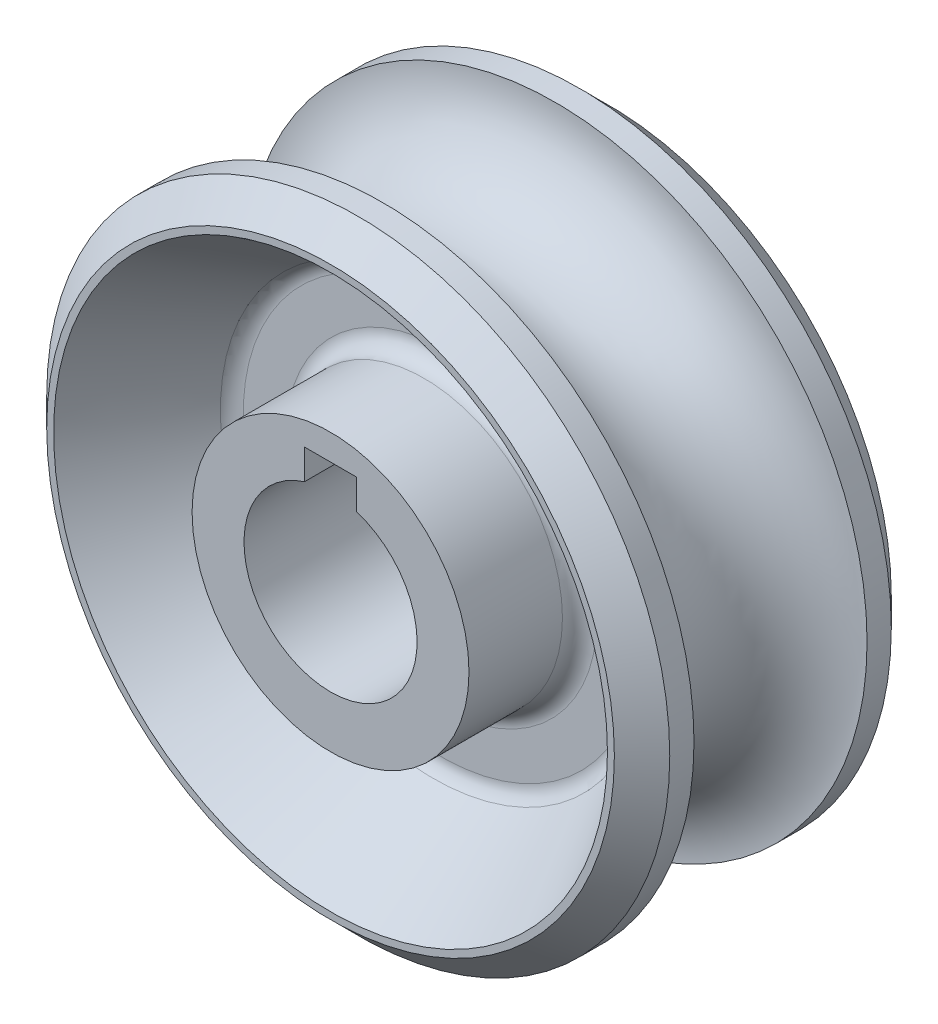
ISO-10303-21;
HEADER;
FILE_DESCRIPTION(('STEP AP214'),'2;1');
FILE_NAME('part.step','',(''),(''),'','','');
FILE_SCHEMA(('AUTOMOTIVE_DESIGN { 1 0 10303 214 1 1 1 1 }'));
ENDSEC;
DATA;
#1=APPLICATION_CONTEXT('core data for automotive mechanical design processes');
#2=APPLICATION_PROTOCOL_DEFINITION('international standard','automotive_design',2000,#1);
#3=PRODUCT_CONTEXT('',#1,'mechanical');
#4=PRODUCT('Part','Part','',(#3));
#5=PRODUCT_RELATED_PRODUCT_CATEGORY('part','',(#4));
#6=PRODUCT_DEFINITION_FORMATION('','',#4);
#7=PRODUCT_DEFINITION_CONTEXT('part definition',#1,'design');
#8=PRODUCT_DEFINITION('design','',#6,#7);
#9=PRODUCT_DEFINITION_SHAPE('','',#8);
#10=(LENGTH_UNIT() NAMED_UNIT(*) SI_UNIT(.MILLI.,.METRE.));
#11=(NAMED_UNIT(*) PLANE_ANGLE_UNIT() SI_UNIT($,.RADIAN.));
#12=(NAMED_UNIT(*) SI_UNIT($,.STERADIAN.) SOLID_ANGLE_UNIT());
#13=UNCERTAINTY_MEASURE_WITH_UNIT(LENGTH_MEASURE(1.E-05),#10,'distance_accuracy_value','');
#14=(GEOMETRIC_REPRESENTATION_CONTEXT(3) GLOBAL_UNCERTAINTY_ASSIGNED_CONTEXT((#13)) GLOBAL_UNIT_ASSIGNED_CONTEXT((#10,
#11,#12)) REPRESENTATION_CONTEXT('',''));
#15=CARTESIAN_POINT('',(0.,0.,0.));
#16=DIRECTION('',(0.,0.,1.));
#17=DIRECTION('',(1.,0.,0.));
#18=AXIS2_PLACEMENT_3D('',#15,#16,#17);
#19=CARTESIAN_POINT('',(0.,0.,12.7));
#20=DIRECTION('',(0.,0.,1.));
#21=DIRECTION('',(1.,0.,0.));
#22=AXIS2_PLACEMENT_3D('',#19,#20,#21);
#23=PLANE('',#22);
#24=CARTESIAN_POINT('',(0.,0.,12.7));
#25=DIRECTION('',(0.,0.,1.));
#26=DIRECTION('',(1.,0.,0.));
#27=AXIS2_PLACEMENT_3D('',#24,#25,#26);
#28=CIRCLE('',#27,26.035);
#29=CARTESIAN_POINT('',(26.035,0.,12.7));
#30=VERTEX_POINT('',#29);
#31=EDGE_CURVE('E136',#30,#30,#28,.T.);
#32=ORIENTED_EDGE('',*,*,#31,.T.);
#33=EDGE_LOOP('',(#32));
#34=FACE_BOUND('',#33,.T.);
#35=CARTESIAN_POINT('',(0.,0.,12.7));
#36=DIRECTION('',(0.,0.,1.));
#37=DIRECTION('',(1.,0.,0.));
#38=AXIS2_PLACEMENT_3D('',#35,#36,#37);
#39=CIRCLE('',#38,25.4);
#40=CARTESIAN_POINT('',(25.4,0.,12.7));
#41=VERTEX_POINT('',#40);
#42=EDGE_CURVE('E112',#41,#41,#39,.T.);
#43=ORIENTED_EDGE('',*,*,#42,.F.);
#44=EDGE_LOOP('',(#43));
#45=FACE_BOUND('',#44,.T.);
#46=ADVANCED_FACE('F37',(#34,#45),#23,.T.);
#47=CARTESIAN_POINT('',(0.,0.,12.7));
#48=DIRECTION('',(0.,0.,-1.));
#49=DIRECTION('',(-1.,0.,0.));
#50=AXIS2_PLACEMENT_3D('',#47,#48,#49);
#51=CYLINDRICAL_SURFACE('',#50,28.575);
#52=CARTESIAN_POINT('',(0.,0.,10.16));
#53=DIRECTION('',(0.,0.,1.));
#54=DIRECTION('',(1.,0.,0.));
#55=AXIS2_PLACEMENT_3D('',#52,#53,#54);
#56=CIRCLE('',#55,28.575);
#57=CARTESIAN_POINT('',(28.575,0.,10.16));
#58=VERTEX_POINT('',#57);
#59=EDGE_CURVE('E139',#58,#58,#56,.F.);
#60=ORIENTED_EDGE('',*,*,#59,.T.);
#61=EDGE_LOOP('',(#60));
#62=FACE_BOUND('',#61,.T.);
#63=CARTESIAN_POINT('',(0.,0.,7.9375));
#64=DIRECTION('',(0.,0.,-1.));
#65=DIRECTION('',(-1.,0.,0.));
#66=AXIS2_PLACEMENT_3D('',#63,#64,#65);
#67=CIRCLE('',#66,28.575);
#68=CARTESIAN_POINT('',(-28.575,0.,7.9375));
#69=VERTEX_POINT('',#68);
#70=EDGE_CURVE('E126',#69,#69,#67,.T.);
#71=ORIENTED_EDGE('',*,*,#70,.F.);
#72=EDGE_LOOP('',(#71));
#73=FACE_BOUND('',#72,.T.);
#74=ADVANCED_FACE('F191',(#62,#73),#51,.T.);
#75=CARTESIAN_POINT('',(0.,0.,-10.16));
#76=DIRECTION('',(0.,0.,1.));
#77=DIRECTION('',(1.,0.,0.));
#78=AXIS2_PLACEMENT_3D('',#75,#76,#77);
#79=CIRCLE('',#78,28.575);
#80=CARTESIAN_POINT('',(28.575,0.,-10.16));
#81=VERTEX_POINT('',#80);
#82=EDGE_CURVE('E122',#81,#81,#79,.T.);
#83=ORIENTED_EDGE('',*,*,#82,.T.);
#84=EDGE_LOOP('',(#83));
#85=FACE_BOUND('',#84,.T.);
#86=CARTESIAN_POINT('',(0.,0.,-7.9375));
#87=DIRECTION('',(0.,0.,1.));
#88=DIRECTION('',(1.,0.,0.));
#89=AXIS2_PLACEMENT_3D('',#86,#87,#88);
#90=CIRCLE('',#89,28.575);
#91=CARTESIAN_POINT('',(28.575,0.,-7.9375));
#92=VERTEX_POINT('',#91);
#93=EDGE_CURVE('E115',#92,#92,#90,.T.);
#94=ORIENTED_EDGE('',*,*,#93,.F.);
#95=EDGE_LOOP('',(#94));
#96=FACE_BOUND('',#95,.T.);
#97=ADVANCED_FACE('F197',(#85,#96),#51,.T.);
#98=CARTESIAN_POINT('',(0.,0.,-12.7));
#99=DIRECTION('',(0.,0.,1.));
#100=DIRECTION('',(1.,0.,0.));
#101=AXIS2_PLACEMENT_3D('',#98,#99,#100);
#102=PLANE('',#101);
#103=CARTESIAN_POINT('',(0.,0.,-12.7));
#104=DIRECTION('',(0.,0.,1.));
#105=DIRECTION('',(1.,0.,0.));
#106=AXIS2_PLACEMENT_3D('',#103,#104,#105);
#107=CIRCLE('',#106,26.035);
#108=CARTESIAN_POINT('',(26.035,0.,-12.7));
#109=VERTEX_POINT('',#108);
#110=EDGE_CURVE('E133',#109,#109,#107,.F.);
#111=ORIENTED_EDGE('',*,*,#110,.T.);
#112=EDGE_LOOP('',(#111));
#113=FACE_BOUND('',#112,.T.);
#114=CARTESIAN_POINT('',(0.,0.,-12.7));
#115=DIRECTION('',(0.,0.,1.));
#116=DIRECTION('',(1.,0.,0.));
#117=AXIS2_PLACEMENT_3D('',#114,#115,#116);
#118=CIRCLE('',#117,25.4);
#119=CARTESIAN_POINT('',(25.4,0.,-12.7));
#120=VERTEX_POINT('',#119);
#121=EDGE_CURVE('E108',#120,#120,#118,.T.);
#122=ORIENTED_EDGE('',*,*,#121,.T.);
#123=EDGE_LOOP('',(#122));
#124=FACE_BOUND('',#123,.T.);
#125=ADVANCED_FACE('F230',(#113,#124),#102,.F.);
#126=CARTESIAN_POINT('',(0.,0.,0.));
#127=DIRECTION('',(0.,0.,1.));
#128=DIRECTION('',(1.,0.,0.));
#129=AXIS2_PLACEMENT_3D('',#126,#127,#128);
#130=TOROIDAL_SURFACE('',#129,28.575,7.9375);
#131=ORIENTED_EDGE('',*,*,#93,.T.);
#132=EDGE_LOOP('',(#131));
#133=FACE_BOUND('',#132,.T.);
#134=ORIENTED_EDGE('',*,*,#70,.T.);
#135=EDGE_LOOP('',(#134));
#136=FACE_BOUND('',#135,.T.);
#137=ADVANCED_FACE('F225',(#133,#136),#130,.F.);
#138=CARTESIAN_POINT('',(0.,0.,0.));
#139=DIRECTION('',(0.,0.,1.));
#140=DIRECTION('',(1.,0.,0.));
#141=AXIS2_PLACEMENT_3D('',#138,#139,#140);
#142=CYLINDRICAL_SURFACE('',#141,12.7);
#143=CARTESIAN_POINT('',(0.,0.,-4.1275));
#144=DIRECTION('',(0.,0.,-1.));
#145=DIRECTION('',(-1.,0.,0.));
#146=AXIS2_PLACEMENT_3D('',#143,#144,#145);
#147=CIRCLE('',#146,12.7);
#148=CARTESIAN_POINT('',(-12.7,0.,-4.1275));
#149=VERTEX_POINT('',#148);
#150=EDGE_CURVE('E151',#149,#149,#147,.T.);
#151=ORIENTED_EDGE('',*,*,#150,.T.);
#152=EDGE_LOOP('',(#151));
#153=FACE_BOUND('',#152,.T.);
#154=CARTESIAN_POINT('',(0.,0.,-12.7));
#155=DIRECTION('',(0.,0.,1.));
#156=DIRECTION('',(1.,0.,0.));
#157=AXIS2_PLACEMENT_3D('',#154,#155,#156);
#158=CIRCLE('',#157,12.7);
#159=CARTESIAN_POINT('',(12.7,0.,-12.7));
#160=VERTEX_POINT('',#159);
#161=EDGE_CURVE('E111',#160,#160,#158,.T.);
#162=ORIENTED_EDGE('',*,*,#161,.T.);
#163=EDGE_LOOP('',(#162));
#164=FACE_BOUND('',#163,.T.);
#165=ADVANCED_FACE('F218',(#153,#164),#142,.T.);
#166=CARTESIAN_POINT('',(0.,12.7,-2.54));
#167=DIRECTION('',(0.,0.,-1.));
#168=DIRECTION('',(-1.,0.,0.));
#169=AXIS2_PLACEMENT_3D('',#166,#167,#168);
#170=PLANE('',#169);
#171=CARTESIAN_POINT('',(0.,0.,-2.54));
#172=DIRECTION('',(0.,0.,-1.));
#173=DIRECTION('',(-1.,0.,0.));
#174=AXIS2_PLACEMENT_3D('',#171,#172,#173);
#175=CIRCLE('',#174,18.1701318691075);
#176=CARTESIAN_POINT('',(-18.1701318691075,0.,-2.54));
#177=VERTEX_POINT('',#176);
#178=EDGE_CURVE('E148',#177,#177,#175,.T.);
#179=ORIENTED_EDGE('',*,*,#178,.T.);
#180=EDGE_LOOP('',(#179));
#181=FACE_BOUND('',#180,.T.);
#182=CARTESIAN_POINT('',(0.,0.,-2.54));
#183=DIRECTION('',(0.,0.,-1.));
#184=DIRECTION('',(-1.,0.,0.));
#185=AXIS2_PLACEMENT_3D('',#182,#183,#184);
#186=CIRCLE('',#185,14.2875);
#187=CARTESIAN_POINT('',(-14.2875,0.,-2.54));
#188=VERTEX_POINT('',#187);
#189=EDGE_CURVE('E145',#188,#188,#186,.F.);
#190=ORIENTED_EDGE('',*,*,#189,.T.);
#191=EDGE_LOOP('',(#190));
#192=FACE_BOUND('',#191,.T.);
#193=ADVANCED_FACE('F212',(#181,#192),#170,.T.);
#194=CARTESIAN_POINT('',(0.,0.,-12.7));
#195=DIRECTION('',(0.,0.,-1.));
#196=DIRECTION('',(-1.,0.,0.));
#197=AXIS2_PLACEMENT_3D('',#194,#195,#196);
#198=CONICAL_SURFACE('',#197,25.4,0.558599315343563);
#199=CARTESIAN_POINT('',(0.,0.,-3.28612668274495));
#200=DIRECTION('',(0.,0.,-1.));
#201=DIRECTION('',(-1.,0.,0.));
#202=AXIS2_PLACEMENT_3D('',#199,#200,#201);
#203=CIRCLE('',#202,19.5163291767156);
#204=CARTESIAN_POINT('',(-19.5163291767156,0.,-3.28612668274495));
#205=VERTEX_POINT('',#204);
#206=EDGE_CURVE('E142',#205,#205,#203,.F.);
#207=ORIENTED_EDGE('',*,*,#206,.T.);
#208=EDGE_LOOP('',(#207));
#209=FACE_BOUND('',#208,.T.);
#210=ORIENTED_EDGE('',*,*,#121,.F.);
#211=EDGE_LOOP('',(#210));
#212=FACE_BOUND('',#211,.T.);
#213=ADVANCED_FACE('F205',(#209,#212),#198,.F.);
#214=DIRECTION('',(0.,-1.,0.));
#215=VECTOR('',#214,1.);
#216=CARTESIAN_POINT('',(-2.3876,0.,12.7));
#217=LINE('',#216,#215);
#218=CARTESIAN_POINT('',(-2.3876,10.3251,12.7));
#219=VERTEX_POINT('',#218);
#220=CARTESIAN_POINT('',(-2.3876,7.56989250187874,12.7));
#221=VERTEX_POINT('',#220);
#222=EDGE_CURVE('E89',#219,#221,#217,.T.);
#223=ORIENTED_EDGE('',*,*,#222,.F.);
#224=DIRECTION('',(-1.,0.,0.));
#225=VECTOR('',#224,1.);
#226=CARTESIAN_POINT('',(2.3876,10.3251,12.7));
#227=LINE('',#226,#225);
#228=CARTESIAN_POINT('',(2.3876,10.3251,12.7));
#229=VERTEX_POINT('',#228);
#230=EDGE_CURVE('E88',#229,#219,#227,.T.);
#231=ORIENTED_EDGE('',*,*,#230,.F.);
#232=DIRECTION('',(0.,1.,0.));
#233=VECTOR('',#232,1.);
#234=CARTESIAN_POINT('',(2.3876,0.,12.7));
#235=LINE('',#234,#233);
#236=CARTESIAN_POINT('',(2.3876,7.56989250187874,12.7));
#237=VERTEX_POINT('',#236);
#238=EDGE_CURVE('E79',#237,#229,#235,.T.);
#239=ORIENTED_EDGE('',*,*,#238,.F.);
#240=CARTESIAN_POINT('',(0.,0.,12.7));
#241=DIRECTION('',(0.,0.,1.));
#242=DIRECTION('',(1.,0.,0.));
#243=AXIS2_PLACEMENT_3D('',#240,#241,#242);
#244=CIRCLE('',#243,7.9375);
#245=EDGE_CURVE('E120',#221,#237,#244,.T.);
#246=ORIENTED_EDGE('',*,*,#245,.F.);
#247=EDGE_LOOP('',(#223,#231,#239,#246));
#248=FACE_BOUND('',#247,.T.);
#249=CARTESIAN_POINT('',(0.,0.,12.7));
#250=DIRECTION('',(0.,0.,1.));
#251=DIRECTION('',(1.,0.,0.));
#252=AXIS2_PLACEMENT_3D('',#249,#250,#251);
#253=CIRCLE('',#252,12.7);
#254=CARTESIAN_POINT('',(12.7,0.,12.7));
#255=VERTEX_POINT('',#254);
#256=EDGE_CURVE('E107',#255,#255,#253,.T.);
#257=ORIENTED_EDGE('',*,*,#256,.T.);
#258=EDGE_LOOP('',(#257));
#259=FACE_BOUND('',#258,.T.);
#260=ADVANCED_FACE('F96',(#248,#259),#23,.T.);
#261=CARTESIAN_POINT('',(0.,0.,12.7));
#262=DIRECTION('',(0.,0.,-1.));
#263=DIRECTION('',(-1.,0.,0.));
#264=AXIS2_PLACEMENT_3D('',#261,#262,#263);
#265=CYLINDRICAL_SURFACE('',#264,7.9375);
#266=DIRECTION('',(0.,0.,-1.));
#267=VECTOR('',#266,1.);
#268=CARTESIAN_POINT('',(-2.3876,7.56989250187874,12.7));
#269=LINE('',#268,#267);
#270=CARTESIAN_POINT('',(-2.3876,7.56989250187874,-12.7));
#271=VERTEX_POINT('',#270);
#272=EDGE_CURVE('E60',#221,#271,#269,.T.);
#273=ORIENTED_EDGE('',*,*,#272,.F.);
#274=ORIENTED_EDGE('',*,*,#245,.T.);
#275=DIRECTION('',(0.,0.,-1.));
#276=VECTOR('',#275,1.);
#277=CARTESIAN_POINT('',(2.3876,7.56989250187874,12.7));
#278=LINE('',#277,#276);
#279=CARTESIAN_POINT('',(2.3876,7.56989250187874,-12.7));
#280=VERTEX_POINT('',#279);
#281=EDGE_CURVE('E83',#280,#237,#278,.F.);
#282=ORIENTED_EDGE('',*,*,#281,.F.);
#283=CARTESIAN_POINT('',(0.,0.,-12.7));
#284=DIRECTION('',(0.,0.,1.));
#285=DIRECTION('',(1.,0.,0.));
#286=AXIS2_PLACEMENT_3D('',#283,#284,#285);
#287=CIRCLE('',#286,7.9375);
#288=EDGE_CURVE('E123',#271,#280,#287,.T.);
#289=ORIENTED_EDGE('',*,*,#288,.F.);
#290=EDGE_LOOP('',(#273,#274,#282,#289));
#291=FACE_BOUND('',#290,.T.);
#292=ADVANCED_FACE('F204',(#291),#265,.F.);
#293=ORIENTED_EDGE('',*,*,#161,.F.);
#294=EDGE_LOOP('',(#293));
#295=FACE_BOUND('',#294,.T.);
#296=DIRECTION('',(-1.,0.,0.));
#297=VECTOR('',#296,1.);
#298=CARTESIAN_POINT('',(2.3876,10.3251,-12.7));
#299=LINE('',#298,#297);
#300=CARTESIAN_POINT('',(2.3876,10.3251,-12.7));
#301=VERTEX_POINT('',#300);
#302=CARTESIAN_POINT('',(-2.3876,10.3251,-12.7));
#303=VERTEX_POINT('',#302);
#304=EDGE_CURVE('E52',#301,#303,#299,.T.);
#305=ORIENTED_EDGE('',*,*,#304,.T.);
#306=DIRECTION('',(0.,-1.,0.));
#307=VECTOR('',#306,1.);
#308=CARTESIAN_POINT('',(-2.3876,0.,-12.7));
#309=LINE('',#308,#307);
#310=EDGE_CURVE('E98',#303,#271,#309,.T.);
#311=ORIENTED_EDGE('',*,*,#310,.T.);
#312=ORIENTED_EDGE('',*,*,#288,.T.);
#313=DIRECTION('',(0.,1.,0.));
#314=VECTOR('',#313,1.);
#315=CARTESIAN_POINT('',(2.3876,0.,-12.7));
#316=LINE('',#315,#314);
#317=EDGE_CURVE('E11',#280,#301,#316,.T.);
#318=ORIENTED_EDGE('',*,*,#317,.T.);
#319=EDGE_LOOP('',(#305,#311,#312,#318));
#320=FACE_BOUND('',#319,.T.);
#321=ADVANCED_FACE('F210',(#295,#320),#102,.F.);
#322=CARTESIAN_POINT('',(0.,0.,2.54));
#323=DIRECTION('',(0.,0.,1.));
#324=DIRECTION('',(1.,0.,0.));
#325=AXIS2_PLACEMENT_3D('',#322,#323,#324);
#326=CONICAL_SURFACE('',#325,19.05,0.558599315343563);
#327=CARTESIAN_POINT('',(0.,0.,3.28612668274495));
#328=DIRECTION('',(0.,0.,1.));
#329=DIRECTION('',(1.,0.,0.));
#330=AXIS2_PLACEMENT_3D('',#327,#328,#329);
#331=CIRCLE('',#330,19.5163291767156);
#332=CARTESIAN_POINT('',(19.5163291767156,0.,3.28612668274495));
#333=VERTEX_POINT('',#332);
#334=EDGE_CURVE('E45',#333,#333,#331,.F.);
#335=ORIENTED_EDGE('',*,*,#334,.T.);
#336=EDGE_LOOP('',(#335));
#337=FACE_BOUND('',#336,.T.);
#338=ORIENTED_EDGE('',*,*,#42,.T.);
#339=EDGE_LOOP('',(#338));
#340=FACE_BOUND('',#339,.T.);
#341=ADVANCED_FACE('F165',(#337,#340),#326,.F.);
#342=CARTESIAN_POINT('',(0.,0.,0.));
#343=DIRECTION('',(0.,0.,1.));
#344=DIRECTION('',(1.,0.,0.));
#345=AXIS2_PLACEMENT_3D('',#342,#343,#344);
#346=CYLINDRICAL_SURFACE('',#345,12.7);
#347=CARTESIAN_POINT('',(0.,0.,4.1275));
#348=DIRECTION('',(0.,0.,1.));
#349=DIRECTION('',(1.,0.,0.));
#350=AXIS2_PLACEMENT_3D('',#347,#348,#349);
#351=CIRCLE('',#350,12.7);
#352=CARTESIAN_POINT('',(12.7,0.,4.1275));
#353=VERTEX_POINT('',#352);
#354=EDGE_CURVE('E154',#353,#353,#351,.T.);
#355=ORIENTED_EDGE('',*,*,#354,.T.);
#356=EDGE_LOOP('',(#355));
#357=FACE_BOUND('',#356,.T.);
#358=ORIENTED_EDGE('',*,*,#256,.F.);
#359=EDGE_LOOP('',(#358));
#360=FACE_BOUND('',#359,.T.);
#361=ADVANCED_FACE('F177',(#357,#360),#346,.T.);
#362=CARTESIAN_POINT('',(0.,12.7,2.54));
#363=DIRECTION('',(0.,0.,1.));
#364=DIRECTION('',(1.,0.,0.));
#365=AXIS2_PLACEMENT_3D('',#362,#363,#364);
#366=PLANE('',#365);
#367=CARTESIAN_POINT('',(0.,0.,2.54));
#368=DIRECTION('',(0.,0.,1.));
#369=DIRECTION('',(1.,0.,0.));
#370=AXIS2_PLACEMENT_3D('',#367,#368,#369);
#371=CIRCLE('',#370,14.2875);
#372=CARTESIAN_POINT('',(14.2875,0.,2.54));
#373=VERTEX_POINT('',#372);
#374=EDGE_CURVE('E160',#373,#373,#371,.F.);
#375=ORIENTED_EDGE('',*,*,#374,.T.);
#376=EDGE_LOOP('',(#375));
#377=FACE_BOUND('',#376,.T.);
#378=CARTESIAN_POINT('',(0.,0.,2.54));
#379=DIRECTION('',(0.,0.,1.));
#380=DIRECTION('',(1.,0.,0.));
#381=AXIS2_PLACEMENT_3D('',#378,#379,#380);
#382=CIRCLE('',#381,18.1701318691075);
#383=CARTESIAN_POINT('',(18.1701318691075,0.,2.54));
#384=VERTEX_POINT('',#383);
#385=EDGE_CURVE('E157',#384,#384,#382,.T.);
#386=ORIENTED_EDGE('',*,*,#385,.T.);
#387=EDGE_LOOP('',(#386));
#388=FACE_BOUND('',#387,.T.);
#389=ADVANCED_FACE('F174',(#377,#388),#366,.T.);
#390=CARTESIAN_POINT('',(0.,0.,-10.16));
#391=DIRECTION('',(0.,0.,1.));
#392=DIRECTION('',(1.,0.,0.));
#393=AXIS2_PLACEMENT_3D('',#390,#391,#392);
#394=CONICAL_SURFACE('',#393,28.575,0.785398163397451);
#395=ORIENTED_EDGE('',*,*,#110,.F.);
#396=EDGE_LOOP('',(#395));
#397=FACE_BOUND('',#396,.T.);
#398=ORIENTED_EDGE('',*,*,#82,.F.);
#399=EDGE_LOOP('',(#398));
#400=FACE_BOUND('',#399,.T.);
#401=ADVANCED_FACE('F176',(#397,#400),#394,.T.);
#402=CARTESIAN_POINT('',(0.,0.,12.7));
#403=DIRECTION('',(0.,0.,-1.));
#404=DIRECTION('',(-1.,0.,0.));
#405=AXIS2_PLACEMENT_3D('',#402,#403,#404);
#406=CONICAL_SURFACE('',#405,26.035,0.785398163397446);
#407=ORIENTED_EDGE('',*,*,#59,.F.);
#408=EDGE_LOOP('',(#407));
#409=FACE_BOUND('',#408,.T.);
#410=ORIENTED_EDGE('',*,*,#31,.F.);
#411=EDGE_LOOP('',(#410));
#412=FACE_BOUND('',#411,.T.);
#413=ADVANCED_FACE('F184',(#409,#412),#406,.T.);
#414=CARTESIAN_POINT('',(0.,0.,-4.1275));
#415=DIRECTION('',(0.,0.,-1.));
#416=DIRECTION('',(-1.,0.,0.));
#417=AXIS2_PLACEMENT_3D('',#414,#415,#416);
#418=TOROIDAL_SURFACE('',#417,18.1701318691075,1.5875);
#419=ORIENTED_EDGE('',*,*,#178,.F.);
#420=EDGE_LOOP('',(#419));
#421=FACE_BOUND('',#420,.T.);
#422=ORIENTED_EDGE('',*,*,#206,.F.);
#423=EDGE_LOOP('',(#422));
#424=FACE_BOUND('',#423,.T.);
#425=ADVANCED_FACE('F303',(#421,#424),#418,.F.);
#426=CARTESIAN_POINT('',(0.,0.,-4.1275));
#427=DIRECTION('',(0.,0.,-1.));
#428=DIRECTION('',(-1.,0.,0.));
#429=AXIS2_PLACEMENT_3D('',#426,#427,#428);
#430=TOROIDAL_SURFACE('',#429,14.2875,1.5875);
#431=ORIENTED_EDGE('',*,*,#150,.F.);
#432=EDGE_LOOP('',(#431));
#433=FACE_BOUND('',#432,.T.);
#434=ORIENTED_EDGE('',*,*,#189,.F.);
#435=EDGE_LOOP('',(#434));
#436=FACE_BOUND('',#435,.T.);
#437=ADVANCED_FACE('F294',(#433,#436),#430,.F.);
#438=CARTESIAN_POINT('',(0.,0.,4.1275));
#439=DIRECTION('',(0.,0.,1.));
#440=DIRECTION('',(1.,0.,0.));
#441=AXIS2_PLACEMENT_3D('',#438,#439,#440);
#442=TOROIDAL_SURFACE('',#441,14.2875,1.5875);
#443=ORIENTED_EDGE('',*,*,#374,.F.);
#444=EDGE_LOOP('',(#443));
#445=FACE_BOUND('',#444,.T.);
#446=ORIENTED_EDGE('',*,*,#354,.F.);
#447=EDGE_LOOP('',(#446));
#448=FACE_BOUND('',#447,.T.);
#449=ADVANCED_FACE('F171',(#445,#448),#442,.F.);
#450=CARTESIAN_POINT('',(0.,0.,4.1275));
#451=DIRECTION('',(0.,0.,1.));
#452=DIRECTION('',(1.,0.,0.));
#453=AXIS2_PLACEMENT_3D('',#450,#451,#452);
#454=TOROIDAL_SURFACE('',#453,18.1701318691075,1.5875);
#455=ORIENTED_EDGE('',*,*,#334,.F.);
#456=EDGE_LOOP('',(#455));
#457=FACE_BOUND('',#456,.T.);
#458=ORIENTED_EDGE('',*,*,#385,.F.);
#459=EDGE_LOOP('',(#458));
#460=FACE_BOUND('',#459,.T.);
#461=ADVANCED_FACE('F39',(#457,#460),#454,.F.);
#462=CARTESIAN_POINT('',(-2.3876,0.,-12.7));
#463=DIRECTION('',(-1.,0.,0.));
#464=DIRECTION('',(0.,0.,1.));
#465=AXIS2_PLACEMENT_3D('',#462,#463,#464);
#466=PLANE('',#465);
#467=ORIENTED_EDGE('',*,*,#272,.T.);
#468=ORIENTED_EDGE('',*,*,#310,.F.);
#469=DIRECTION('',(0.,0.,1.));
#470=VECTOR('',#469,1.);
#471=CARTESIAN_POINT('',(-2.3876,10.3251,-12.7));
#472=LINE('',#471,#470);
#473=EDGE_CURVE('E94',#303,#219,#472,.T.);
#474=ORIENTED_EDGE('',*,*,#473,.T.);
#475=ORIENTED_EDGE('',*,*,#222,.T.);
#476=EDGE_LOOP('',(#467,#468,#474,#475));
#477=FACE_BOUND('',#476,.T.);
#478=ADVANCED_FACE('F170',(#477),#466,.F.);
#479=CARTESIAN_POINT('',(2.3876,10.3251,-12.7));
#480=DIRECTION('',(0.,1.,0.));
#481=DIRECTION('',(0.,0.,1.));
#482=AXIS2_PLACEMENT_3D('',#479,#480,#481);
#483=PLANE('',#482);
#484=ORIENTED_EDGE('',*,*,#473,.F.);
#485=ORIENTED_EDGE('',*,*,#304,.F.);
#486=DIRECTION('',(0.,0.,1.));
#487=VECTOR('',#486,1.);
#488=CARTESIAN_POINT('',(2.3876,10.3251,-12.7));
#489=LINE('',#488,#487);
#490=EDGE_CURVE('E81',#301,#229,#489,.T.);
#491=ORIENTED_EDGE('',*,*,#490,.T.);
#492=ORIENTED_EDGE('',*,*,#230,.T.);
#493=EDGE_LOOP('',(#484,#485,#491,#492));
#494=FACE_BOUND('',#493,.T.);
#495=ADVANCED_FACE('F92',(#494),#483,.F.);
#496=CARTESIAN_POINT('',(2.3876,0.,-12.7));
#497=DIRECTION('',(1.,0.,0.));
#498=DIRECTION('',(0.,0.,-1.));
#499=AXIS2_PLACEMENT_3D('',#496,#497,#498);
#500=PLANE('',#499);
#501=ORIENTED_EDGE('',*,*,#281,.T.);
#502=ORIENTED_EDGE('',*,*,#238,.T.);
#503=ORIENTED_EDGE('',*,*,#490,.F.);
#504=ORIENTED_EDGE('',*,*,#317,.F.);
#505=EDGE_LOOP('',(#501,#502,#503,#504));
#506=FACE_BOUND('',#505,.T.);
#507=ADVANCED_FACE('F80',(#506),#500,.F.);
#508=CLOSED_SHELL('',(#46,#74,#97,#125,#137,#165,#193,#213,#260,#292,#321,#341,#361,#389,#401,
#413,#425,#437,#449,#461,#478,#495,#507));
#509=MANIFOLD_SOLID_BREP('B2',#508);
#510=ADVANCED_BREP_SHAPE_REPRESENTATION('',(#18,#509),#14);
#511=SHAPE_DEFINITION_REPRESENTATION(#9,#510);
ENDSEC;
END-ISO-10303-21;
